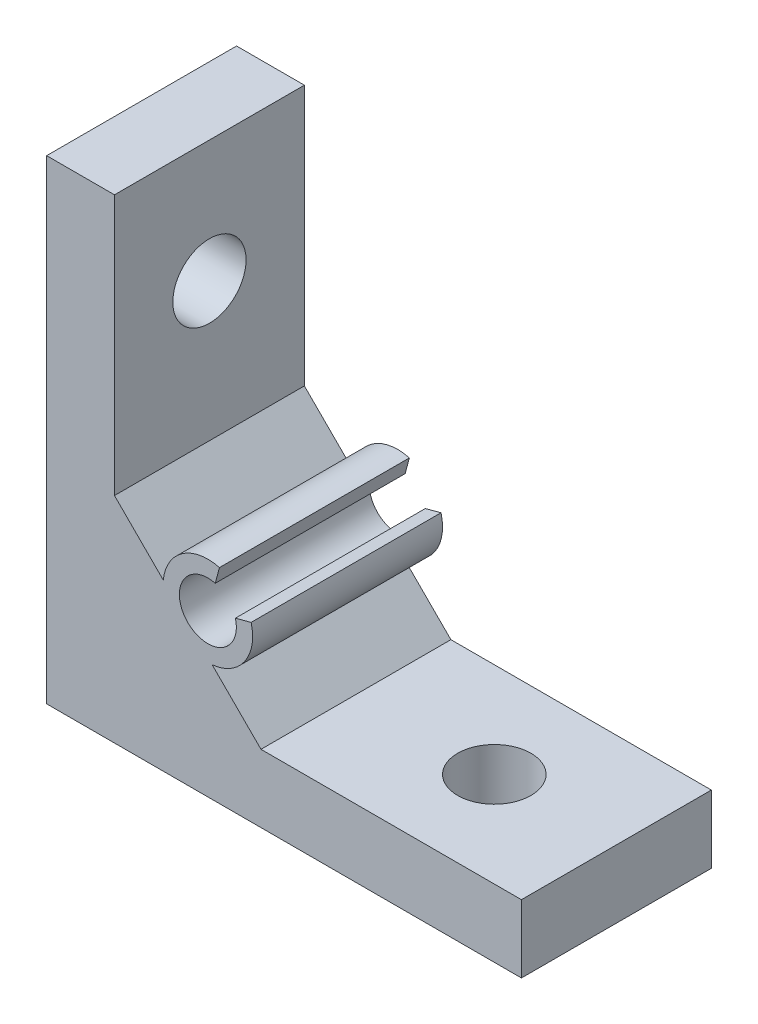
ISO-10303-21;
HEADER;
FILE_DESCRIPTION(('STEP AP214'),'2;1');
FILE_NAME('part.step','',(''),(''),'','','');
FILE_SCHEMA(('AUTOMOTIVE_DESIGN { 1 0 10303 214 1 1 1 1 }'));
ENDSEC;
DATA;
#1=APPLICATION_CONTEXT('core data for automotive mechanical design processes');
#2=APPLICATION_PROTOCOL_DEFINITION('international standard','automotive_design',2000,#1);
#3=PRODUCT_CONTEXT('',#1,'mechanical');
#4=PRODUCT('Part','Part','',(#3));
#5=PRODUCT_RELATED_PRODUCT_CATEGORY('part','',(#4));
#6=PRODUCT_DEFINITION_FORMATION('','',#4);
#7=PRODUCT_DEFINITION_CONTEXT('part definition',#1,'design');
#8=PRODUCT_DEFINITION('design','',#6,#7);
#9=PRODUCT_DEFINITION_SHAPE('','',#8);
#10=(LENGTH_UNIT() NAMED_UNIT(*) SI_UNIT(.MILLI.,.METRE.));
#11=(NAMED_UNIT(*) PLANE_ANGLE_UNIT() SI_UNIT($,.RADIAN.));
#12=(NAMED_UNIT(*) SI_UNIT($,.STERADIAN.) SOLID_ANGLE_UNIT());
#13=UNCERTAINTY_MEASURE_WITH_UNIT(LENGTH_MEASURE(1.E-05),#10,'distance_accuracy_value','');
#14=(GEOMETRIC_REPRESENTATION_CONTEXT(3) GLOBAL_UNCERTAINTY_ASSIGNED_CONTEXT((#13)) GLOBAL_UNIT_ASSIGNED_CONTEXT((#10,
#11,#12)) REPRESENTATION_CONTEXT('',''));
#15=CARTESIAN_POINT('',(0.,0.,0.));
#16=DIRECTION('',(0.,0.,1.));
#17=DIRECTION('',(1.,0.,0.));
#18=AXIS2_PLACEMENT_3D('',#15,#16,#17);
#19=CARTESIAN_POINT('',(5.,35.,7.));
#20=DIRECTION('',(0.,-1.,0.));
#21=DIRECTION('',(0.,0.,-1.));
#22=AXIS2_PLACEMENT_3D('',#19,#20,#21);
#23=PLANE('',#22);
#24=DIRECTION('',(-1.,0.,0.));
#25=VECTOR('',#24,1.);
#26=CARTESIAN_POINT('',(5.,35.,-7.));
#27=LINE('',#26,#25);
#28=CARTESIAN_POINT('',(5.,35.,-7.));
#29=VERTEX_POINT('',#28);
#30=CARTESIAN_POINT('',(0.,35.,-7.));
#31=VERTEX_POINT('',#30);
#32=EDGE_CURVE('E158',#29,#31,#27,.T.);
#33=ORIENTED_EDGE('',*,*,#32,.T.);
#34=DIRECTION('',(0.,0.,-1.));
#35=VECTOR('',#34,1.);
#36=CARTESIAN_POINT('',(0.,35.,7.));
#37=LINE('',#36,#35);
#38=CARTESIAN_POINT('',(0.,35.,7.));
#39=VERTEX_POINT('',#38);
#40=EDGE_CURVE('E11',#39,#31,#37,.T.);
#41=ORIENTED_EDGE('',*,*,#40,.F.);
#42=DIRECTION('',(-1.,0.,0.));
#43=VECTOR('',#42,1.);
#44=CARTESIAN_POINT('',(5.,35.,7.));
#45=LINE('',#44,#43);
#46=CARTESIAN_POINT('',(5.,35.,7.));
#47=VERTEX_POINT('',#46);
#48=EDGE_CURVE('E183',#47,#39,#45,.T.);
#49=ORIENTED_EDGE('',*,*,#48,.F.);
#50=DIRECTION('',(0.,0.,-1.));
#51=VECTOR('',#50,1.);
#52=CARTESIAN_POINT('',(5.,35.,7.));
#53=LINE('',#52,#51);
#54=EDGE_CURVE('E154',#47,#29,#53,.T.);
#55=ORIENTED_EDGE('',*,*,#54,.T.);
#56=EDGE_LOOP('',(#33,#41,#49,#55));
#57=FACE_BOUND('',#56,.T.);
#58=ADVANCED_FACE('F32',(#57),#23,.F.);
#59=CARTESIAN_POINT('',(0.,35.,7.));
#60=DIRECTION('',(1.,0.,0.));
#61=DIRECTION('',(0.,1.,0.));
#62=AXIS2_PLACEMENT_3D('',#59,#60,#61);
#63=PLANE('',#62);
#64=CARTESIAN_POINT('',(0.,26.,0.));
#65=DIRECTION('',(1.,0.,0.));
#66=DIRECTION('',(0.,0.,-1.));
#67=AXIS2_PLACEMENT_3D('',#64,#65,#66);
#68=CIRCLE('',#67,2.7);
#69=CARTESIAN_POINT('',(0.,26.,-2.7));
#70=VERTEX_POINT('',#69);
#71=EDGE_CURVE('E372',#70,#70,#68,.T.);
#72=ORIENTED_EDGE('',*,*,#71,.T.);
#73=EDGE_LOOP('',(#72));
#74=FACE_BOUND('',#73,.T.);
#75=DIRECTION('',(0.,-1.,0.));
#76=VECTOR('',#75,1.);
#77=CARTESIAN_POINT('',(0.,35.,-7.));
#78=LINE('',#77,#76);
#79=CARTESIAN_POINT('',(0.,0.,-7.));
#80=VERTEX_POINT('',#79);
#81=EDGE_CURVE('E161',#31,#80,#78,.T.);
#82=ORIENTED_EDGE('',*,*,#81,.T.);
#83=DIRECTION('',(0.,0.,-1.));
#84=VECTOR('',#83,1.);
#85=CARTESIAN_POINT('',(0.,0.,7.));
#86=LINE('',#85,#84);
#87=CARTESIAN_POINT('',(0.,0.,7.));
#88=VERTEX_POINT('',#87);
#89=EDGE_CURVE('E40',#88,#80,#86,.T.);
#90=ORIENTED_EDGE('',*,*,#89,.F.);
#91=DIRECTION('',(0.,-1.,0.));
#92=VECTOR('',#91,1.);
#93=CARTESIAN_POINT('',(0.,35.,7.));
#94=LINE('',#93,#92);
#95=EDGE_CURVE('E106',#39,#88,#94,.T.);
#96=ORIENTED_EDGE('',*,*,#95,.F.);
#97=ORIENTED_EDGE('',*,*,#40,.T.);
#98=EDGE_LOOP('',(#82,#90,#96,#97));
#99=FACE_BOUND('',#98,.T.);
#100=ADVANCED_FACE('F268',(#74,#99),#63,.F.);
#101=CARTESIAN_POINT('',(0.,0.,7.));
#102=DIRECTION('',(0.,1.,0.));
#103=DIRECTION('',(0.,0.,1.));
#104=AXIS2_PLACEMENT_3D('',#101,#102,#103);
#105=PLANE('',#104);
#106=CARTESIAN_POINT('',(26.,0.,0.));
#107=DIRECTION('',(0.,1.,0.));
#108=DIRECTION('',(-1.,0.,0.));
#109=AXIS2_PLACEMENT_3D('',#106,#107,#108);
#110=CIRCLE('',#109,2.7);
#111=CARTESIAN_POINT('',(23.3,0.,0.));
#112=VERTEX_POINT('',#111);
#113=EDGE_CURVE('E162',#112,#112,#110,.T.);
#114=ORIENTED_EDGE('',*,*,#113,.T.);
#115=EDGE_LOOP('',(#114));
#116=FACE_BOUND('',#115,.T.);
#117=DIRECTION('',(1.,0.,0.));
#118=VECTOR('',#117,1.);
#119=CARTESIAN_POINT('',(0.,0.,-7.));
#120=LINE('',#119,#118);
#121=CARTESIAN_POINT('',(35.,0.,-7.));
#122=VERTEX_POINT('',#121);
#123=EDGE_CURVE('E164',#80,#122,#120,.T.);
#124=ORIENTED_EDGE('',*,*,#123,.T.);
#125=DIRECTION('',(0.,0.,-1.));
#126=VECTOR('',#125,1.);
#127=CARTESIAN_POINT('',(35.,0.,7.));
#128=LINE('',#127,#126);
#129=CARTESIAN_POINT('',(35.,0.,7.));
#130=VERTEX_POINT('',#129);
#131=EDGE_CURVE('E205',#130,#122,#128,.T.);
#132=ORIENTED_EDGE('',*,*,#131,.F.);
#133=DIRECTION('',(1.,0.,0.));
#134=VECTOR('',#133,1.);
#135=CARTESIAN_POINT('',(0.,0.,7.));
#136=LINE('',#135,#134);
#137=EDGE_CURVE('E213',#88,#130,#136,.T.);
#138=ORIENTED_EDGE('',*,*,#137,.F.);
#139=ORIENTED_EDGE('',*,*,#89,.T.);
#140=EDGE_LOOP('',(#124,#132,#138,#139));
#141=FACE_BOUND('',#140,.T.);
#142=ADVANCED_FACE('F211',(#116,#141),#105,.F.);
#143=CARTESIAN_POINT('',(35.,0.,7.));
#144=DIRECTION('',(-1.,0.,0.));
#145=DIRECTION('',(0.,0.,1.));
#146=AXIS2_PLACEMENT_3D('',#143,#144,#145);
#147=PLANE('',#146);
#148=DIRECTION('',(0.,1.,0.));
#149=VECTOR('',#148,1.);
#150=CARTESIAN_POINT('',(35.,0.,-7.));
#151=LINE('',#150,#149);
#152=CARTESIAN_POINT('',(35.,5.,-7.));
#153=VERTEX_POINT('',#152);
#154=EDGE_CURVE('E166',#122,#153,#151,.T.);
#155=ORIENTED_EDGE('',*,*,#154,.T.);
#156=DIRECTION('',(0.,0.,-1.));
#157=VECTOR('',#156,1.);
#158=CARTESIAN_POINT('',(35.,5.,7.));
#159=LINE('',#158,#157);
#160=CARTESIAN_POINT('',(35.,5.,7.));
#161=VERTEX_POINT('',#160);
#162=EDGE_CURVE('E202',#161,#153,#159,.T.);
#163=ORIENTED_EDGE('',*,*,#162,.F.);
#164=DIRECTION('',(0.,1.,0.));
#165=VECTOR('',#164,1.);
#166=CARTESIAN_POINT('',(35.,0.,7.));
#167=LINE('',#166,#165);
#168=EDGE_CURVE('E231',#130,#161,#167,.T.);
#169=ORIENTED_EDGE('',*,*,#168,.F.);
#170=ORIENTED_EDGE('',*,*,#131,.T.);
#171=EDGE_LOOP('',(#155,#163,#169,#170));
#172=FACE_BOUND('',#171,.T.);
#173=ADVANCED_FACE('F222',(#172),#147,.F.);
#174=CARTESIAN_POINT('',(35.,5.,7.));
#175=DIRECTION('',(0.,-1.,0.));
#176=DIRECTION('',(1.,0.,0.));
#177=AXIS2_PLACEMENT_3D('',#174,#175,#176);
#178=PLANE('',#177);
#179=CARTESIAN_POINT('',(26.,5.,0.));
#180=DIRECTION('',(0.,1.,0.));
#181=DIRECTION('',(-1.,0.,0.));
#182=AXIS2_PLACEMENT_3D('',#179,#180,#181);
#183=CIRCLE('',#182,2.7);
#184=CARTESIAN_POINT('',(23.3,5.,0.));
#185=VERTEX_POINT('',#184);
#186=EDGE_CURVE('E376',#185,#185,#183,.T.);
#187=ORIENTED_EDGE('',*,*,#186,.F.);
#188=EDGE_LOOP('',(#187));
#189=FACE_BOUND('',#188,.T.);
#190=DIRECTION('',(-1.,0.,0.));
#191=VECTOR('',#190,1.);
#192=CARTESIAN_POINT('',(35.,5.,-7.));
#193=LINE('',#192,#191);
#194=CARTESIAN_POINT('',(15.8,5.,-7.));
#195=VERTEX_POINT('',#194);
#196=EDGE_CURVE('E168',#153,#195,#193,.T.);
#197=ORIENTED_EDGE('',*,*,#196,.T.);
#198=DIRECTION('',(0.,0.,-1.));
#199=VECTOR('',#198,1.);
#200=CARTESIAN_POINT('',(15.8,5.,7.));
#201=LINE('',#200,#199);
#202=CARTESIAN_POINT('',(15.8,5.,7.));
#203=VERTEX_POINT('',#202);
#204=EDGE_CURVE('E199',#203,#195,#201,.T.);
#205=ORIENTED_EDGE('',*,*,#204,.F.);
#206=DIRECTION('',(-1.,0.,0.));
#207=VECTOR('',#206,1.);
#208=CARTESIAN_POINT('',(35.,5.,7.));
#209=LINE('',#208,#207);
#210=EDGE_CURVE('E228',#161,#203,#209,.T.);
#211=ORIENTED_EDGE('',*,*,#210,.F.);
#212=ORIENTED_EDGE('',*,*,#162,.T.);
#213=EDGE_LOOP('',(#197,#205,#211,#212));
#214=FACE_BOUND('',#213,.T.);
#215=ADVANCED_FACE('F226',(#189,#214),#178,.F.);
#216=CARTESIAN_POINT('',(15.8,5.,7.));
#217=DIRECTION('',(-0.707106781186548,-0.707106781186547,0.));
#218=DIRECTION('',(0.707106781186547,-0.707106781186548,0.));
#219=AXIS2_PLACEMENT_3D('',#216,#217,#218);
#220=PLANE('',#219);
#221=DIRECTION('',(-0.707106781186547,0.707106781186548,0.));
#222=VECTOR('',#221,1.);
#223=CARTESIAN_POINT('',(15.8,5.,-7.));
#224=LINE('',#223,#222);
#225=CARTESIAN_POINT('',(12.2,8.6,-7.));
#226=VERTEX_POINT('',#225);
#227=EDGE_CURVE('E170',#195,#226,#224,.T.);
#228=ORIENTED_EDGE('',*,*,#227,.T.);
#229=DIRECTION('',(0.,0.,-1.));
#230=VECTOR('',#229,1.);
#231=CARTESIAN_POINT('',(12.2,8.6,7.));
#232=LINE('',#231,#230);
#233=CARTESIAN_POINT('',(12.2,8.6,7.));
#234=VERTEX_POINT('',#233);
#235=EDGE_CURVE('E196',#234,#226,#232,.T.);
#236=ORIENTED_EDGE('',*,*,#235,.F.);
#237=DIRECTION('',(-0.707106781186547,0.707106781186548,0.));
#238=VECTOR('',#237,1.);
#239=CARTESIAN_POINT('',(15.8,5.,7.));
#240=LINE('',#239,#238);
#241=EDGE_CURVE('E230',#203,#234,#240,.T.);
#242=ORIENTED_EDGE('',*,*,#241,.F.);
#243=ORIENTED_EDGE('',*,*,#204,.T.);
#244=EDGE_LOOP('',(#228,#236,#242,#243));
#245=FACE_BOUND('',#244,.T.);
#246=ADVANCED_FACE('F284',(#245),#220,.F.);
#247=CARTESIAN_POINT('',(11.8849242404918,11.8849242404918,7.));
#248=DIRECTION('',(0.,0.,-1.));
#249=DIRECTION('',(-1.,0.,0.));
#250=AXIS2_PLACEMENT_3D('',#247,#248,#249);
#251=CYLINDRICAL_SURFACE('',#250,3.3);
#252=CARTESIAN_POINT('',(11.8849242404918,11.8849242404918,-7.));
#253=DIRECTION('',(0.,0.,1.));
#254=DIRECTION('',(1.,0.,0.));
#255=AXIS2_PLACEMENT_3D('',#252,#253,#254);
#256=CIRCLE('',#255,3.3);
#257=CARTESIAN_POINT('',(15.0724794672457,12.7390270893301,-7.));
#258=VERTEX_POINT('',#257);
#259=EDGE_CURVE('E172',#226,#258,#256,.T.);
#260=ORIENTED_EDGE('',*,*,#259,.T.);
#261=DIRECTION('',(0.,0.,-1.));
#262=VECTOR('',#261,1.);
#263=CARTESIAN_POINT('',(15.0724794672457,12.7390270893301,7.));
#264=LINE('',#263,#262);
#265=CARTESIAN_POINT('',(15.0724794672457,12.7390270893301,7.));
#266=VERTEX_POINT('',#265);
#267=EDGE_CURVE('E193',#266,#258,#264,.T.);
#268=ORIENTED_EDGE('',*,*,#267,.F.);
#269=CARTESIAN_POINT('',(11.8849242404918,11.8849242404918,7.));
#270=DIRECTION('',(0.,0.,1.));
#271=DIRECTION('',(1.,0.,0.));
#272=AXIS2_PLACEMENT_3D('',#269,#270,#271);
#273=CIRCLE('',#272,3.3);
#274=EDGE_CURVE('E233',#234,#266,#273,.T.);
#275=ORIENTED_EDGE('',*,*,#274,.F.);
#276=ORIENTED_EDGE('',*,*,#235,.T.);
#277=EDGE_LOOP('',(#260,#268,#275,#276));
#278=FACE_BOUND('',#277,.T.);
#279=ADVANCED_FACE('F288',(#278),#251,.T.);
#280=CARTESIAN_POINT('',(13.9133684756988,12.428444235207,7.));
#281=DIRECTION('',(0.258819045102522,-0.965925826289068,0.));
#282=DIRECTION('',(0.965925826289068,0.258819045102522,0.));
#283=AXIS2_PLACEMENT_3D('',#280,#281,#282);
#284=PLANE('',#283);
#285=DIRECTION('',(-0.965925826289068,-0.258819045102522,0.));
#286=VECTOR('',#285,1.);
#287=CARTESIAN_POINT('',(13.9133684756988,12.428444235207,-7.));
#288=LINE('',#287,#286);
#289=CARTESIAN_POINT('',(13.9133684756988,12.428444235207,-7.));
#290=VERTEX_POINT('',#289);
#291=EDGE_CURVE('E174',#258,#290,#288,.T.);
#292=ORIENTED_EDGE('',*,*,#291,.T.);
#293=DIRECTION('',(0.,0.,-1.));
#294=VECTOR('',#293,1.);
#295=CARTESIAN_POINT('',(13.9133684756988,12.428444235207,7.));
#296=LINE('',#295,#294);
#297=CARTESIAN_POINT('',(13.9133684756988,12.428444235207,7.));
#298=VERTEX_POINT('',#297);
#299=EDGE_CURVE('E190',#298,#290,#296,.T.);
#300=ORIENTED_EDGE('',*,*,#299,.F.);
#301=DIRECTION('',(-0.965925826289068,-0.258819045102522,0.));
#302=VECTOR('',#301,1.);
#303=CARTESIAN_POINT('',(13.9133684756988,12.428444235207,7.));
#304=LINE('',#303,#302);
#305=EDGE_CURVE('E239',#266,#298,#304,.T.);
#306=ORIENTED_EDGE('',*,*,#305,.F.);
#307=ORIENTED_EDGE('',*,*,#267,.T.);
#308=EDGE_LOOP('',(#292,#300,#306,#307));
#309=FACE_BOUND('',#308,.T.);
#310=ADVANCED_FACE('F292',(#309),#284,.F.);
#311=CARTESIAN_POINT('',(11.8849242404918,11.8849242404918,7.));
#312=DIRECTION('',(0.,0.,-1.));
#313=DIRECTION('',(-1.,0.,0.));
#314=AXIS2_PLACEMENT_3D('',#311,#312,#313);
#315=CYLINDRICAL_SURFACE('',#314,2.1);
#316=CARTESIAN_POINT('',(11.8849242404918,11.8849242404918,-7.));
#317=DIRECTION('',(0.,0.,-1.));
#318=DIRECTION('',(1.,0.,0.));
#319=AXIS2_PLACEMENT_3D('',#316,#317,#318);
#320=CIRCLE('',#319,2.1);
#321=CARTESIAN_POINT('',(12.428444235207,13.9133684756988,-7.));
#322=VERTEX_POINT('',#321);
#323=EDGE_CURVE('E176',#290,#322,#320,.T.);
#324=ORIENTED_EDGE('',*,*,#323,.T.);
#325=DIRECTION('',(0.,0.,-1.));
#326=VECTOR('',#325,1.);
#327=CARTESIAN_POINT('',(12.428444235207,13.9133684756988,7.));
#328=LINE('',#327,#326);
#329=CARTESIAN_POINT('',(12.428444235207,13.9133684756988,7.));
#330=VERTEX_POINT('',#329);
#331=EDGE_CURVE('E187',#330,#322,#328,.T.);
#332=ORIENTED_EDGE('',*,*,#331,.F.);
#333=CARTESIAN_POINT('',(11.8849242404918,11.8849242404918,7.));
#334=DIRECTION('',(0.,0.,-1.));
#335=DIRECTION('',(1.,0.,0.));
#336=AXIS2_PLACEMENT_3D('',#333,#334,#335);
#337=CIRCLE('',#336,2.1);
#338=EDGE_CURVE('E241',#298,#330,#337,.T.);
#339=ORIENTED_EDGE('',*,*,#338,.F.);
#340=ORIENTED_EDGE('',*,*,#299,.T.);
#341=EDGE_LOOP('',(#324,#332,#339,#340));
#342=FACE_BOUND('',#341,.T.);
#343=ADVANCED_FACE('F247',(#342),#315,.F.);
#344=CARTESIAN_POINT('',(12.73902708933,15.0724794672457,7.));
#345=DIRECTION('',(-0.96592582628907,0.258819045102513,0.));
#346=DIRECTION('',(-0.258819045102513,-0.96592582628907,0.));
#347=AXIS2_PLACEMENT_3D('',#344,#345,#346);
#348=PLANE('',#347);
#349=DIRECTION('',(0.258819045102513,0.96592582628907,0.));
#350=VECTOR('',#349,1.);
#351=CARTESIAN_POINT('',(12.73902708933,15.0724794672457,-7.));
#352=LINE('',#351,#350);
#353=CARTESIAN_POINT('',(12.73902708933,15.0724794672457,-7.));
#354=VERTEX_POINT('',#353);
#355=EDGE_CURVE('E178',#322,#354,#352,.T.);
#356=ORIENTED_EDGE('',*,*,#355,.T.);
#357=DIRECTION('',(0.,0.,-1.));
#358=VECTOR('',#357,1.);
#359=CARTESIAN_POINT('',(12.73902708933,15.0724794672457,7.));
#360=LINE('',#359,#358);
#361=CARTESIAN_POINT('',(12.73902708933,15.0724794672457,7.));
#362=VERTEX_POINT('',#361);
#363=EDGE_CURVE('E149',#362,#354,#360,.T.);
#364=ORIENTED_EDGE('',*,*,#363,.F.);
#365=DIRECTION('',(0.258819045102513,0.96592582628907,0.));
#366=VECTOR('',#365,1.);
#367=CARTESIAN_POINT('',(12.73902708933,15.0724794672457,7.));
#368=LINE('',#367,#366);
#369=EDGE_CURVE('E140',#330,#362,#368,.T.);
#370=ORIENTED_EDGE('',*,*,#369,.F.);
#371=ORIENTED_EDGE('',*,*,#331,.T.);
#372=EDGE_LOOP('',(#356,#364,#370,#371));
#373=FACE_BOUND('',#372,.T.);
#374=ADVANCED_FACE('F251',(#373),#348,.F.);
#375=CARTESIAN_POINT('',(11.8849242404918,11.8849242404918,7.));
#376=DIRECTION('',(0.,0.,-1.));
#377=DIRECTION('',(-1.,0.,0.));
#378=AXIS2_PLACEMENT_3D('',#375,#376,#377);
#379=CYLINDRICAL_SURFACE('',#378,3.3);
#380=CARTESIAN_POINT('',(11.8849242404918,11.8849242404918,-7.));
#381=DIRECTION('',(0.,0.,1.));
#382=DIRECTION('',(1.,0.,0.));
#383=AXIS2_PLACEMENT_3D('',#380,#381,#382);
#384=CIRCLE('',#383,3.3);
#385=CARTESIAN_POINT('',(8.6,12.2,-7.));
#386=VERTEX_POINT('',#385);
#387=EDGE_CURVE('E148',#354,#386,#384,.T.);
#388=ORIENTED_EDGE('',*,*,#387,.T.);
#389=DIRECTION('',(0.,0.,-1.));
#390=VECTOR('',#389,1.);
#391=CARTESIAN_POINT('',(8.6,12.2,7.));
#392=LINE('',#391,#390);
#393=CARTESIAN_POINT('',(8.6,12.2,7.));
#394=VERTEX_POINT('',#393);
#395=EDGE_CURVE('E145',#394,#386,#392,.T.);
#396=ORIENTED_EDGE('',*,*,#395,.F.);
#397=CARTESIAN_POINT('',(11.8849242404918,11.8849242404918,7.));
#398=DIRECTION('',(0.,0.,1.));
#399=DIRECTION('',(1.,0.,0.));
#400=AXIS2_PLACEMENT_3D('',#397,#398,#399);
#401=CIRCLE('',#400,3.3);
#402=EDGE_CURVE('E134',#362,#394,#401,.T.);
#403=ORIENTED_EDGE('',*,*,#402,.F.);
#404=ORIENTED_EDGE('',*,*,#363,.T.);
#405=EDGE_LOOP('',(#388,#396,#403,#404));
#406=FACE_BOUND('',#405,.T.);
#407=ADVANCED_FACE('F146',(#406),#379,.T.);
#408=CARTESIAN_POINT('',(8.6,12.2,7.));
#409=DIRECTION('',(-0.707106781186548,-0.707106781186547,0.));
#410=DIRECTION('',(0.707106781186547,-0.707106781186548,0.));
#411=AXIS2_PLACEMENT_3D('',#408,#409,#410);
#412=PLANE('',#411);
#413=DIRECTION('',(-0.707106781186547,0.707106781186548,0.));
#414=VECTOR('',#413,1.);
#415=CARTESIAN_POINT('',(8.6,12.2,-7.));
#416=LINE('',#415,#414);
#417=CARTESIAN_POINT('',(5.,15.8,-7.));
#418=VERTEX_POINT('',#417);
#419=EDGE_CURVE('E92',#386,#418,#416,.T.);
#420=ORIENTED_EDGE('',*,*,#419,.T.);
#421=DIRECTION('',(0.,0.,-1.));
#422=VECTOR('',#421,1.);
#423=CARTESIAN_POINT('',(5.,15.8,7.));
#424=LINE('',#423,#422);
#425=CARTESIAN_POINT('',(5.,15.8,7.));
#426=VERTEX_POINT('',#425);
#427=EDGE_CURVE('E150',#426,#418,#424,.T.);
#428=ORIENTED_EDGE('',*,*,#427,.F.);
#429=DIRECTION('',(-0.707106781186547,0.707106781186548,0.));
#430=VECTOR('',#429,1.);
#431=CARTESIAN_POINT('',(8.6,12.2,7.));
#432=LINE('',#431,#430);
#433=EDGE_CURVE('E138',#394,#426,#432,.T.);
#434=ORIENTED_EDGE('',*,*,#433,.F.);
#435=ORIENTED_EDGE('',*,*,#395,.T.);
#436=EDGE_LOOP('',(#420,#428,#434,#435));
#437=FACE_BOUND('',#436,.T.);
#438=ADVANCED_FACE('F152',(#437),#412,.F.);
#439=CARTESIAN_POINT('',(5.,15.8,7.));
#440=DIRECTION('',(-1.,0.,0.));
#441=DIRECTION('',(0.,0.,1.));
#442=AXIS2_PLACEMENT_3D('',#439,#440,#441);
#443=PLANE('',#442);
#444=CARTESIAN_POINT('',(5.,26.,0.));
#445=DIRECTION('',(1.,0.,0.));
#446=DIRECTION('',(0.,0.,-1.));
#447=AXIS2_PLACEMENT_3D('',#444,#445,#446);
#448=CIRCLE('',#447,2.7);
#449=CARTESIAN_POINT('',(5.,26.,-2.7));
#450=VERTEX_POINT('',#449);
#451=EDGE_CURVE('E374',#450,#450,#448,.T.);
#452=ORIENTED_EDGE('',*,*,#451,.F.);
#453=EDGE_LOOP('',(#452));
#454=FACE_BOUND('',#453,.T.);
#455=DIRECTION('',(0.,1.,0.));
#456=VECTOR('',#455,1.);
#457=CARTESIAN_POINT('',(5.,15.8,-7.));
#458=LINE('',#457,#456);
#459=EDGE_CURVE('E98',#418,#29,#458,.T.);
#460=ORIENTED_EDGE('',*,*,#459,.T.);
#461=ORIENTED_EDGE('',*,*,#54,.F.);
#462=DIRECTION('',(0.,1.,0.));
#463=VECTOR('',#462,1.);
#464=CARTESIAN_POINT('',(5.,15.8,7.));
#465=LINE('',#464,#463);
#466=EDGE_CURVE('E48',#426,#47,#465,.T.);
#467=ORIENTED_EDGE('',*,*,#466,.F.);
#468=ORIENTED_EDGE('',*,*,#427,.T.);
#469=EDGE_LOOP('',(#460,#461,#467,#468));
#470=FACE_BOUND('',#469,.T.);
#471=ADVANCED_FACE('F255',(#454,#470),#443,.F.);
#472=CARTESIAN_POINT('',(11.8849242404918,11.8849242404918,7.));
#473=DIRECTION('',(0.,0.,1.));
#474=DIRECTION('',(1.,0.,0.));
#475=AXIS2_PLACEMENT_3D('',#472,#473,#474);
#476=PLANE('',#475);
#477=ORIENTED_EDGE('',*,*,#48,.T.);
#478=ORIENTED_EDGE('',*,*,#95,.T.);
#479=ORIENTED_EDGE('',*,*,#137,.T.);
#480=ORIENTED_EDGE('',*,*,#168,.T.);
#481=ORIENTED_EDGE('',*,*,#210,.T.);
#482=ORIENTED_EDGE('',*,*,#241,.T.);
#483=ORIENTED_EDGE('',*,*,#274,.T.);
#484=ORIENTED_EDGE('',*,*,#305,.T.);
#485=ORIENTED_EDGE('',*,*,#338,.T.);
#486=ORIENTED_EDGE('',*,*,#369,.T.);
#487=ORIENTED_EDGE('',*,*,#402,.T.);
#488=ORIENTED_EDGE('',*,*,#433,.T.);
#489=ORIENTED_EDGE('',*,*,#466,.T.);
#490=EDGE_LOOP('',(#477,#478,#479,#480,#481,#482,#483,#484,#485,#486,#487,#488,#489));
#491=FACE_BOUND('',#490,.T.);
#492=ADVANCED_FACE('F136',(#491),#476,.T.);
#493=CARTESIAN_POINT('',(11.8849242404918,11.8849242404918,-7.));
#494=DIRECTION('',(0.,0.,1.));
#495=DIRECTION('',(1.,0.,0.));
#496=AXIS2_PLACEMENT_3D('',#493,#494,#495);
#497=PLANE('',#496);
#498=ORIENTED_EDGE('',*,*,#32,.F.);
#499=ORIENTED_EDGE('',*,*,#459,.F.);
#500=ORIENTED_EDGE('',*,*,#419,.F.);
#501=ORIENTED_EDGE('',*,*,#387,.F.);
#502=ORIENTED_EDGE('',*,*,#355,.F.);
#503=ORIENTED_EDGE('',*,*,#323,.F.);
#504=ORIENTED_EDGE('',*,*,#291,.F.);
#505=ORIENTED_EDGE('',*,*,#259,.F.);
#506=ORIENTED_EDGE('',*,*,#227,.F.);
#507=ORIENTED_EDGE('',*,*,#196,.F.);
#508=ORIENTED_EDGE('',*,*,#154,.F.);
#509=ORIENTED_EDGE('',*,*,#123,.F.);
#510=ORIENTED_EDGE('',*,*,#81,.F.);
#511=EDGE_LOOP('',(#498,#499,#500,#501,#502,#503,#504,#505,#506,#507,#508,#509,#510));
#512=FACE_BOUND('',#511,.T.);
#513=ADVANCED_FACE('F217',(#512),#497,.F.);
#514=CARTESIAN_POINT('',(26.,0.,0.));
#515=DIRECTION('',(0.,1.,0.));
#516=DIRECTION('',(-1.,0.,0.));
#517=AXIS2_PLACEMENT_3D('',#514,#515,#516);
#518=CYLINDRICAL_SURFACE('',#517,2.7);
#519=ORIENTED_EDGE('',*,*,#113,.F.);
#520=EDGE_LOOP('',(#519));
#521=FACE_BOUND('',#520,.T.);
#522=ORIENTED_EDGE('',*,*,#186,.T.);
#523=EDGE_LOOP('',(#522));
#524=FACE_BOUND('',#523,.T.);
#525=ADVANCED_FACE('F326',(#521,#524),#518,.F.);
#526=CARTESIAN_POINT('',(0.,26.,0.));
#527=DIRECTION('',(1.,0.,0.));
#528=DIRECTION('',(0.,0.,-1.));
#529=AXIS2_PLACEMENT_3D('',#526,#527,#528);
#530=CYLINDRICAL_SURFACE('',#529,2.7);
#531=ORIENTED_EDGE('',*,*,#71,.F.);
#532=EDGE_LOOP('',(#531));
#533=FACE_BOUND('',#532,.T.);
#534=ORIENTED_EDGE('',*,*,#451,.T.);
#535=EDGE_LOOP('',(#534));
#536=FACE_BOUND('',#535,.T.);
#537=ADVANCED_FACE('F348',(#533,#536),#530,.F.);
#538=CLOSED_SHELL('',(#58,#100,#142,#173,#215,#246,#279,#310,#343,#374,#407,#438,#471,#492,#513,
#525,#537));
#539=MANIFOLD_SOLID_BREP('B2',#538);
#540=ADVANCED_BREP_SHAPE_REPRESENTATION('',(#18,#539),#14);
#541=SHAPE_DEFINITION_REPRESENTATION(#9,#540);
ENDSEC;
END-ISO-10303-21;
